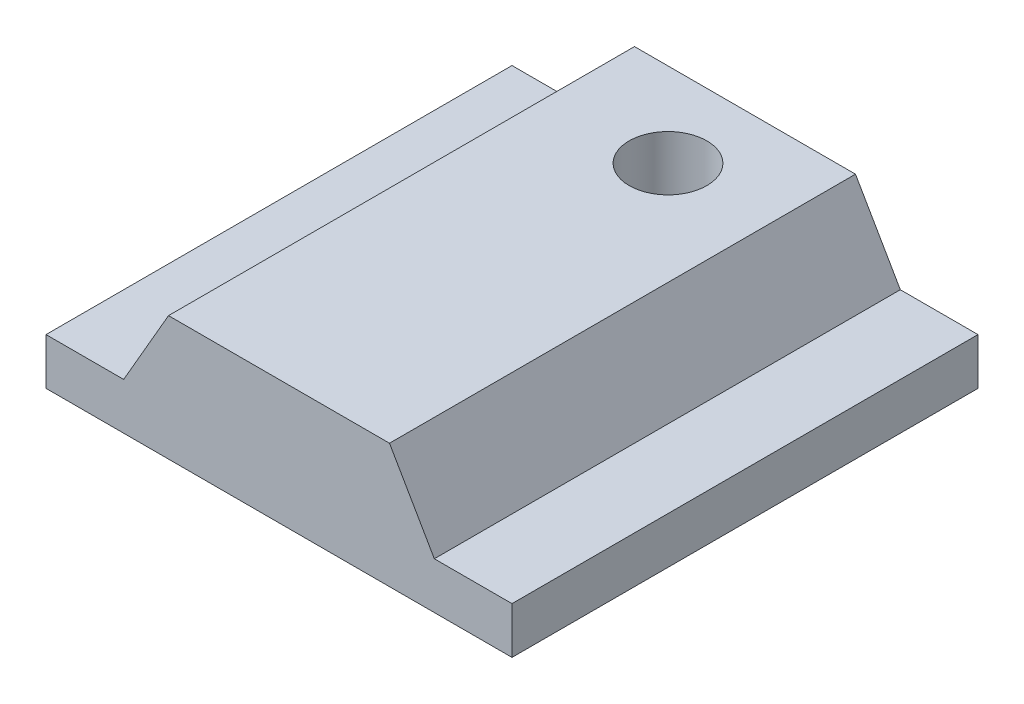
ISO-10303-21;
HEADER;
FILE_DESCRIPTION(('STEP AP214'),'2;1');
FILE_NAME('part.step','',(''),(''),'','','');
FILE_SCHEMA(('AUTOMOTIVE_DESIGN { 1 0 10303 214 1 1 1 1 }'));
ENDSEC;
DATA;
#1=APPLICATION_CONTEXT('core data for automotive mechanical design processes');
#2=APPLICATION_PROTOCOL_DEFINITION('international standard','automotive_design',2000,#1);
#3=PRODUCT_CONTEXT('',#1,'mechanical');
#4=PRODUCT('Part','Part','',(#3));
#5=PRODUCT_RELATED_PRODUCT_CATEGORY('part','',(#4));
#6=PRODUCT_DEFINITION_FORMATION('','',#4);
#7=PRODUCT_DEFINITION_CONTEXT('part definition',#1,'design');
#8=PRODUCT_DEFINITION('design','',#6,#7);
#9=PRODUCT_DEFINITION_SHAPE('','',#8);
#10=(LENGTH_UNIT() NAMED_UNIT(*) SI_UNIT(.MILLI.,.METRE.));
#11=(NAMED_UNIT(*) PLANE_ANGLE_UNIT() SI_UNIT($,.RADIAN.));
#12=(NAMED_UNIT(*) SI_UNIT($,.STERADIAN.) SOLID_ANGLE_UNIT());
#13=UNCERTAINTY_MEASURE_WITH_UNIT(LENGTH_MEASURE(1.E-05),#10,'distance_accuracy_value','');
#14=(GEOMETRIC_REPRESENTATION_CONTEXT(3) GLOBAL_UNCERTAINTY_ASSIGNED_CONTEXT((#13)) GLOBAL_UNIT_ASSIGNED_CONTEXT((#10,
#11,#12)) REPRESENTATION_CONTEXT('',''));
#15=CARTESIAN_POINT('',(0.,0.,0.));
#16=DIRECTION('',(0.,0.,1.));
#17=DIRECTION('',(1.,0.,0.));
#18=AXIS2_PLACEMENT_3D('',#15,#16,#17);
#19=CARTESIAN_POINT('',(30.,0.,30.));
#20=DIRECTION('',(0.,1.,0.));
#21=DIRECTION('',(-1.,0.,0.));
#22=AXIS2_PLACEMENT_3D('',#19,#20,#21);
#23=PLANE('',#22);
#24=CARTESIAN_POINT('',(15.4685454313324,0.,5.4251775164289));
#25=DIRECTION('',(0.,1.,0.));
#26=DIRECTION('',(-1.,0.,0.));
#27=AXIS2_PLACEMENT_3D('',#24,#25,#26);
#28=CIRCLE('',#27,2.5);
#29=CARTESIAN_POINT('',(12.9685454313324,0.,5.4251775164289));
#30=VERTEX_POINT('',#29);
#31=EDGE_CURVE('E176',#30,#30,#28,.T.);
#32=ORIENTED_EDGE('',*,*,#31,.T.);
#33=EDGE_LOOP('',(#32));
#34=FACE_BOUND('',#33,.T.);
#35=DIRECTION('',(1.,0.,0.));
#36=VECTOR('',#35,1.);
#37=CARTESIAN_POINT('',(30.,0.,0.));
#38=LINE('',#37,#36);
#39=CARTESIAN_POINT('',(0.,0.,0.));
#40=VERTEX_POINT('',#39);
#41=CARTESIAN_POINT('',(30.,0.,0.));
#42=VERTEX_POINT('',#41);
#43=EDGE_CURVE('E122',#40,#42,#38,.T.);
#44=ORIENTED_EDGE('',*,*,#43,.T.);
#45=DIRECTION('',(0.,0.,-1.));
#46=VECTOR('',#45,1.);
#47=CARTESIAN_POINT('',(30.,0.,30.));
#48=LINE('',#47,#46);
#49=CARTESIAN_POINT('',(30.,0.,30.));
#50=VERTEX_POINT('',#49);
#51=EDGE_CURVE('E11',#50,#42,#48,.T.);
#52=ORIENTED_EDGE('',*,*,#51,.F.);
#53=DIRECTION('',(1.,0.,0.));
#54=VECTOR('',#53,1.);
#55=CARTESIAN_POINT('',(30.,0.,30.));
#56=LINE('',#55,#54);
#57=CARTESIAN_POINT('',(0.,0.,30.));
#58=VERTEX_POINT('',#57);
#59=EDGE_CURVE('E123',#58,#50,#56,.T.);
#60=ORIENTED_EDGE('',*,*,#59,.F.);
#61=DIRECTION('',(0.,0.,-1.));
#62=VECTOR('',#61,1.);
#63=CARTESIAN_POINT('',(0.,0.,30.));
#64=LINE('',#63,#62);
#65=EDGE_CURVE('E44',#58,#40,#64,.T.);
#66=ORIENTED_EDGE('',*,*,#65,.T.);
#67=EDGE_LOOP('',(#44,#52,#60,#66));
#68=FACE_BOUND('',#67,.T.);
#69=ADVANCED_FACE('F37',(#34,#68),#23,.F.);
#70=CARTESIAN_POINT('',(30.,8.,30.));
#71=DIRECTION('',(-1.,0.,0.));
#72=DIRECTION('',(0.,-1.,0.));
#73=AXIS2_PLACEMENT_3D('',#70,#71,#72);
#74=PLANE('',#73);
#75=DIRECTION('',(0.,1.,0.));
#76=VECTOR('',#75,1.);
#77=CARTESIAN_POINT('',(30.,8.,0.));
#78=LINE('',#77,#76);
#79=CARTESIAN_POINT('',(30.,3.,0.));
#80=VERTEX_POINT('',#79);
#81=EDGE_CURVE('E130',#42,#80,#78,.T.);
#82=ORIENTED_EDGE('',*,*,#81,.T.);
#83=DIRECTION('',(0.,0.,1.));
#84=VECTOR('',#83,1.);
#85=CARTESIAN_POINT('',(30.,3.,0.));
#86=LINE('',#85,#84);
#87=CARTESIAN_POINT('',(30.,3.,30.));
#88=VERTEX_POINT('',#87);
#89=EDGE_CURVE('E142',#80,#88,#86,.T.);
#90=ORIENTED_EDGE('',*,*,#89,.T.);
#91=DIRECTION('',(0.,1.,0.));
#92=VECTOR('',#91,1.);
#93=CARTESIAN_POINT('',(30.,8.,30.));
#94=LINE('',#93,#92);
#95=EDGE_CURVE('E127',#50,#88,#94,.T.);
#96=ORIENTED_EDGE('',*,*,#95,.F.);
#97=ORIENTED_EDGE('',*,*,#51,.T.);
#98=EDGE_LOOP('',(#82,#90,#96,#97));
#99=FACE_BOUND('',#98,.T.);
#100=ADVANCED_FACE('F146',(#99),#74,.F.);
#101=CARTESIAN_POINT('',(0.,8.,30.));
#102=DIRECTION('',(0.,-1.,0.));
#103=DIRECTION('',(0.,0.,-1.));
#104=AXIS2_PLACEMENT_3D('',#101,#102,#103);
#105=PLANE('',#104);
#106=CARTESIAN_POINT('',(15.4685454313324,8.,5.4251775164289));
#107=DIRECTION('',(0.,1.,0.));
#108=DIRECTION('',(0.,0.,1.));
#109=AXIS2_PLACEMENT_3D('',#106,#107,#108);
#110=CIRCLE('',#109,2.5);
#111=CARTESIAN_POINT('',(15.4685454313324,8.,7.9251775164289));
#112=VERTEX_POINT('',#111);
#113=EDGE_CURVE('E179',#112,#112,#110,.T.);
#114=ORIENTED_EDGE('',*,*,#113,.F.);
#115=EDGE_LOOP('',(#114));
#116=FACE_BOUND('',#115,.T.);
#117=DIRECTION('',(-1.,0.,0.));
#118=VECTOR('',#117,1.);
#119=CARTESIAN_POINT('',(0.,8.,0.));
#120=LINE('',#119,#118);
#121=CARTESIAN_POINT('',(22.1132486540518,8.,0.));
#122=VERTEX_POINT('',#121);
#123=CARTESIAN_POINT('',(7.88675134594816,8.,0.));
#124=VERTEX_POINT('',#123);
#125=EDGE_CURVE('E124',#122,#124,#120,.T.);
#126=ORIENTED_EDGE('',*,*,#125,.T.);
#127=DIRECTION('',(0.,0.,1.));
#128=VECTOR('',#127,1.);
#129=CARTESIAN_POINT('',(7.88675134594816,8.,0.));
#130=LINE('',#129,#128);
#131=CARTESIAN_POINT('',(7.88675134594816,8.,30.));
#132=VERTEX_POINT('',#131);
#133=EDGE_CURVE('E162',#124,#132,#130,.T.);
#134=ORIENTED_EDGE('',*,*,#133,.T.);
#135=DIRECTION('',(-1.,0.,0.));
#136=VECTOR('',#135,1.);
#137=CARTESIAN_POINT('',(0.,8.,30.));
#138=LINE('',#137,#136);
#139=CARTESIAN_POINT('',(22.1132486540518,8.,30.));
#140=VERTEX_POINT('',#139);
#141=EDGE_CURVE('E135',#140,#132,#138,.T.);
#142=ORIENTED_EDGE('',*,*,#141,.F.);
#143=DIRECTION('',(0.,0.,1.));
#144=VECTOR('',#143,1.);
#145=CARTESIAN_POINT('',(22.1132486540518,8.,0.));
#146=LINE('',#145,#144);
#147=EDGE_CURVE('E152',#122,#140,#146,.T.);
#148=ORIENTED_EDGE('',*,*,#147,.F.);
#149=EDGE_LOOP('',(#126,#134,#142,#148));
#150=FACE_BOUND('',#149,.T.);
#151=ADVANCED_FACE('F173',(#116,#150),#105,.F.);
#152=CARTESIAN_POINT('',(0.,0.,30.));
#153=DIRECTION('',(1.,0.,0.));
#154=DIRECTION('',(0.,0.,-1.));
#155=AXIS2_PLACEMENT_3D('',#152,#153,#154);
#156=PLANE('',#155);
#157=DIRECTION('',(0.,-1.,0.));
#158=VECTOR('',#157,1.);
#159=CARTESIAN_POINT('',(0.,0.,30.));
#160=LINE('',#159,#158);
#161=CARTESIAN_POINT('',(0.,3.,30.));
#162=VERTEX_POINT('',#161);
#163=EDGE_CURVE('E117',#162,#58,#160,.T.);
#164=ORIENTED_EDGE('',*,*,#163,.F.);
#165=DIRECTION('',(0.,0.,1.));
#166=VECTOR('',#165,1.);
#167=CARTESIAN_POINT('',(0.,3.,0.));
#168=LINE('',#167,#166);
#169=CARTESIAN_POINT('',(0.,3.,0.));
#170=VERTEX_POINT('',#169);
#171=EDGE_CURVE('E104',#170,#162,#168,.T.);
#172=ORIENTED_EDGE('',*,*,#171,.F.);
#173=DIRECTION('',(0.,-1.,0.));
#174=VECTOR('',#173,1.);
#175=CARTESIAN_POINT('',(0.,0.,0.));
#176=LINE('',#175,#174);
#177=EDGE_CURVE('E115',#170,#40,#176,.T.);
#178=ORIENTED_EDGE('',*,*,#177,.T.);
#179=ORIENTED_EDGE('',*,*,#65,.F.);
#180=EDGE_LOOP('',(#164,#172,#178,#179));
#181=FACE_BOUND('',#180,.T.);
#182=ADVANCED_FACE('F113',(#181),#156,.F.);
#183=CARTESIAN_POINT('',(0.,0.,30.));
#184=DIRECTION('',(0.,0.,-1.));
#185=DIRECTION('',(-1.,0.,0.));
#186=AXIS2_PLACEMENT_3D('',#183,#184,#185);
#187=PLANE('',#186);
#188=ORIENTED_EDGE('',*,*,#141,.T.);
#189=DIRECTION('',(0.500000000000004,0.866025403784436,0.));
#190=VECTOR('',#189,1.);
#191=CARTESIAN_POINT('',(5.,3.,30.));
#192=LINE('',#191,#190);
#193=CARTESIAN_POINT('',(5.,3.,30.));
#194=VERTEX_POINT('',#193);
#195=EDGE_CURVE('E109',#194,#132,#192,.T.);
#196=ORIENTED_EDGE('',*,*,#195,.F.);
#197=DIRECTION('',(1.,0.,0.));
#198=VECTOR('',#197,1.);
#199=CARTESIAN_POINT('',(5.,3.,30.));
#200=LINE('',#199,#198);
#201=EDGE_CURVE('E178',#162,#194,#200,.T.);
#202=ORIENTED_EDGE('',*,*,#201,.F.);
#203=ORIENTED_EDGE('',*,*,#163,.T.);
#204=ORIENTED_EDGE('',*,*,#59,.T.);
#205=ORIENTED_EDGE('',*,*,#95,.T.);
#206=DIRECTION('',(1.,0.,0.));
#207=VECTOR('',#206,1.);
#208=CARTESIAN_POINT('',(25.,3.,30.));
#209=LINE('',#208,#207);
#210=CARTESIAN_POINT('',(25.,3.,30.));
#211=VERTEX_POINT('',#210);
#212=EDGE_CURVE('E156',#211,#88,#209,.T.);
#213=ORIENTED_EDGE('',*,*,#212,.F.);
#214=DIRECTION('',(0.500000000000004,-0.866025403784436,0.));
#215=VECTOR('',#214,1.);
#216=CARTESIAN_POINT('',(25.,3.,30.));
#217=LINE('',#216,#215);
#218=EDGE_CURVE('E159',#140,#211,#217,.T.);
#219=ORIENTED_EDGE('',*,*,#218,.F.);
#220=EDGE_LOOP('',(#188,#196,#202,#203,#204,#205,#213,#219));
#221=FACE_BOUND('',#220,.T.);
#222=ADVANCED_FACE('F166',(#221),#187,.F.);
#223=CARTESIAN_POINT('',(0.,0.,0.));
#224=DIRECTION('',(0.,0.,-1.));
#225=DIRECTION('',(-1.,0.,0.));
#226=AXIS2_PLACEMENT_3D('',#223,#224,#225);
#227=PLANE('',#226);
#228=DIRECTION('',(0.500000000000004,0.866025403784436,0.));
#229=VECTOR('',#228,1.);
#230=CARTESIAN_POINT('',(5.,3.,0.));
#231=LINE('',#230,#229);
#232=CARTESIAN_POINT('',(5.,3.,0.));
#233=VERTEX_POINT('',#232);
#234=EDGE_CURVE('E51',#233,#124,#231,.T.);
#235=ORIENTED_EDGE('',*,*,#234,.T.);
#236=ORIENTED_EDGE('',*,*,#125,.F.);
#237=DIRECTION('',(0.500000000000004,-0.866025403784436,0.));
#238=VECTOR('',#237,1.);
#239=CARTESIAN_POINT('',(25.,3.,0.));
#240=LINE('',#239,#238);
#241=CARTESIAN_POINT('',(25.,3.,0.));
#242=VERTEX_POINT('',#241);
#243=EDGE_CURVE('E151',#122,#242,#240,.T.);
#244=ORIENTED_EDGE('',*,*,#243,.T.);
#245=DIRECTION('',(1.,0.,0.));
#246=VECTOR('',#245,1.);
#247=CARTESIAN_POINT('',(25.,3.,0.));
#248=LINE('',#247,#246);
#249=EDGE_CURVE('E59',#242,#80,#248,.T.);
#250=ORIENTED_EDGE('',*,*,#249,.T.);
#251=ORIENTED_EDGE('',*,*,#81,.F.);
#252=ORIENTED_EDGE('',*,*,#43,.F.);
#253=ORIENTED_EDGE('',*,*,#177,.F.);
#254=DIRECTION('',(1.,0.,0.));
#255=VECTOR('',#254,1.);
#256=CARTESIAN_POINT('',(5.,3.,0.));
#257=LINE('',#256,#255);
#258=EDGE_CURVE('E100',#170,#233,#257,.T.);
#259=ORIENTED_EDGE('',*,*,#258,.T.);
#260=EDGE_LOOP('',(#235,#236,#244,#250,#251,#252,#253,#259));
#261=FACE_BOUND('',#260,.T.);
#262=ADVANCED_FACE('F120',(#261),#227,.T.);
#263=CARTESIAN_POINT('',(25.,3.,0.));
#264=DIRECTION('',(0.,-1.,0.));
#265=DIRECTION('',(0.,0.,-1.));
#266=AXIS2_PLACEMENT_3D('',#263,#264,#265);
#267=PLANE('',#266);
#268=ORIENTED_EDGE('',*,*,#212,.T.);
#269=ORIENTED_EDGE('',*,*,#89,.F.);
#270=ORIENTED_EDGE('',*,*,#249,.F.);
#271=DIRECTION('',(0.,0.,1.));
#272=VECTOR('',#271,1.);
#273=CARTESIAN_POINT('',(25.,3.,0.));
#274=LINE('',#273,#272);
#275=EDGE_CURVE('E154',#242,#211,#274,.T.);
#276=ORIENTED_EDGE('',*,*,#275,.T.);
#277=EDGE_LOOP('',(#268,#269,#270,#276));
#278=FACE_BOUND('',#277,.T.);
#279=ADVANCED_FACE('F196',(#278),#267,.F.);
#280=CARTESIAN_POINT('',(25.,3.,0.));
#281=DIRECTION('',(-0.866025403784436,-0.500000000000004,0.));
#282=DIRECTION('',(0.500000000000004,-0.866025403784436,0.));
#283=AXIS2_PLACEMENT_3D('',#280,#281,#282);
#284=PLANE('',#283);
#285=ORIENTED_EDGE('',*,*,#218,.T.);
#286=ORIENTED_EDGE('',*,*,#275,.F.);
#287=ORIENTED_EDGE('',*,*,#243,.F.);
#288=ORIENTED_EDGE('',*,*,#147,.T.);
#289=EDGE_LOOP('',(#285,#286,#287,#288));
#290=FACE_BOUND('',#289,.T.);
#291=ADVANCED_FACE('F195',(#290),#284,.F.);
#292=CARTESIAN_POINT('',(5.,3.,0.));
#293=DIRECTION('',(0.866025403784436,-0.500000000000004,0.));
#294=DIRECTION('',(0.500000000000004,0.866025403784436,0.));
#295=AXIS2_PLACEMENT_3D('',#292,#293,#294);
#296=PLANE('',#295);
#297=ORIENTED_EDGE('',*,*,#195,.T.);
#298=ORIENTED_EDGE('',*,*,#133,.F.);
#299=ORIENTED_EDGE('',*,*,#234,.F.);
#300=DIRECTION('',(0.,0.,1.));
#301=VECTOR('',#300,1.);
#302=CARTESIAN_POINT('',(5.,3.,0.));
#303=LINE('',#302,#301);
#304=EDGE_CURVE('E106',#233,#194,#303,.T.);
#305=ORIENTED_EDGE('',*,*,#304,.T.);
#306=EDGE_LOOP('',(#297,#298,#299,#305));
#307=FACE_BOUND('',#306,.T.);
#308=ADVANCED_FACE('F189',(#307),#296,.F.);
#309=CARTESIAN_POINT('',(5.,3.,0.));
#310=DIRECTION('',(0.,-1.,0.));
#311=DIRECTION('',(0.,0.,-1.));
#312=AXIS2_PLACEMENT_3D('',#309,#310,#311);
#313=PLANE('',#312);
#314=ORIENTED_EDGE('',*,*,#201,.T.);
#315=ORIENTED_EDGE('',*,*,#304,.F.);
#316=ORIENTED_EDGE('',*,*,#258,.F.);
#317=ORIENTED_EDGE('',*,*,#171,.T.);
#318=EDGE_LOOP('',(#314,#315,#316,#317));
#319=FACE_BOUND('',#318,.T.);
#320=ADVANCED_FACE('F103',(#319),#313,.F.);
#321=CARTESIAN_POINT('',(15.4685454313324,8.,5.4251775164289));
#322=DIRECTION('',(0.,1.,0.));
#323=DIRECTION('',(0.,0.,1.));
#324=AXIS2_PLACEMENT_3D('',#321,#322,#323);
#325=CYLINDRICAL_SURFACE('',#324,2.5);
#326=ORIENTED_EDGE('',*,*,#113,.T.);
#327=EDGE_LOOP('',(#326));
#328=FACE_BOUND('',#327,.T.);
#329=ORIENTED_EDGE('',*,*,#31,.F.);
#330=EDGE_LOOP('',(#329));
#331=FACE_BOUND('',#330,.T.);
#332=ADVANCED_FACE('F218',(#328,#331),#325,.F.);
#333=CLOSED_SHELL('',(#69,#100,#151,#182,#222,#262,#279,#291,#308,#320,#332));
#334=MANIFOLD_SOLID_BREP('B2',#333);
#335=ADVANCED_BREP_SHAPE_REPRESENTATION('',(#18,#334),#14);
#336=SHAPE_DEFINITION_REPRESENTATION(#9,#335);
ENDSEC;
END-ISO-10303-21;
